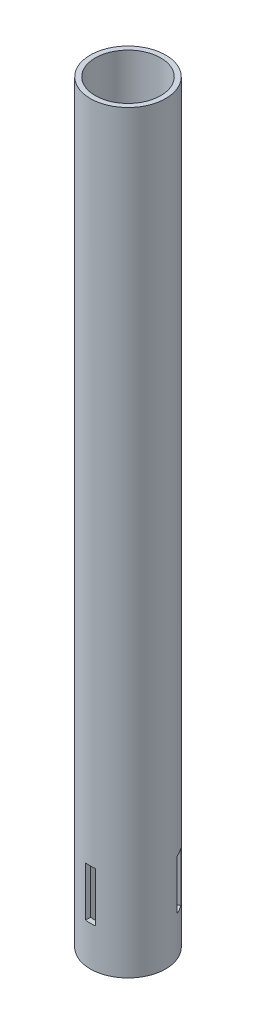
ISO-10303-21;
HEADER;
FILE_DESCRIPTION(('STEP AP214'),'2;1');
FILE_NAME('part.step','',(''),(''),'','','');
FILE_SCHEMA(('AUTOMOTIVE_DESIGN { 1 0 10303 214 1 1 1 1 }'));
ENDSEC;
DATA;
#1=APPLICATION_CONTEXT('core data for automotive mechanical design processes');
#2=APPLICATION_PROTOCOL_DEFINITION('international standard','automotive_design',2000,#1);
#3=PRODUCT_CONTEXT('',#1,'mechanical');
#4=PRODUCT('Part','Part','',(#3));
#5=PRODUCT_RELATED_PRODUCT_CATEGORY('part','',(#4));
#6=PRODUCT_DEFINITION_FORMATION('','',#4);
#7=PRODUCT_DEFINITION_CONTEXT('part definition',#1,'design');
#8=PRODUCT_DEFINITION('design','',#6,#7);
#9=PRODUCT_DEFINITION_SHAPE('','',#8);
#10=(LENGTH_UNIT() NAMED_UNIT(*) SI_UNIT(.MILLI.,.METRE.));
#11=(NAMED_UNIT(*) PLANE_ANGLE_UNIT() SI_UNIT($,.RADIAN.));
#12=(NAMED_UNIT(*) SI_UNIT($,.STERADIAN.) SOLID_ANGLE_UNIT());
#13=UNCERTAINTY_MEASURE_WITH_UNIT(LENGTH_MEASURE(1.E-05),#10,'distance_accuracy_value','');
#14=(GEOMETRIC_REPRESENTATION_CONTEXT(3) GLOBAL_UNCERTAINTY_ASSIGNED_CONTEXT((#13)) GLOBAL_UNIT_ASSIGNED_CONTEXT((#10,
#11,#12)) REPRESENTATION_CONTEXT('',''));
#15=CARTESIAN_POINT('',(0.,0.,0.));
#16=DIRECTION('',(0.,0.,1.));
#17=DIRECTION('',(1.,0.,0.));
#18=AXIS2_PLACEMENT_3D('',#15,#16,#17);
#19=CARTESIAN_POINT('',(0.,760.,0.));
#20=DIRECTION('',(0.,-1.,0.));
#21=DIRECTION('',(0.,0.,-1.));
#22=AXIS2_PLACEMENT_3D('',#19,#20,#21);
#23=CYLINDRICAL_SURFACE('',#22,38.);
#24=CARTESIAN_POINT('',(0.,40.,0.));
#25=DIRECTION('',(0.,1.,0.));
#26=DIRECTION('',(0.,0.,1.));
#27=AXIS2_PLACEMENT_3D('',#24,#25,#26);
#28=CIRCLE('',#27,38.);
#29=CARTESIAN_POINT('',(-5.,40.,37.6696164036747));
#30=VERTEX_POINT('',#29);
#31=CARTESIAN_POINT('',(5.,40.,37.6696164036747));
#32=VERTEX_POINT('',#31);
#33=EDGE_CURVE('E203',#30,#32,#28,.T.);
#34=ORIENTED_EDGE('',*,*,#33,.F.);
#35=DIRECTION('',(0.,-1.,0.));
#36=VECTOR('',#35,1.);
#37=CARTESIAN_POINT('',(-5.00000000000003,760.,37.6696164036747));
#38=LINE('',#37,#36);
#39=CARTESIAN_POINT('',(-5.00000000000003,89.9999999999999,37.6696164036747));
#40=VERTEX_POINT('',#39);
#41=EDGE_CURVE('E192',#30,#40,#38,.F.);
#42=ORIENTED_EDGE('',*,*,#41,.T.);
#43=CARTESIAN_POINT('',(0.,89.9999999999999,0.));
#44=DIRECTION('',(0.,1.,0.));
#45=DIRECTION('',(0.,0.,1.));
#46=AXIS2_PLACEMENT_3D('',#43,#44,#45);
#47=CIRCLE('',#46,38.);
#48=CARTESIAN_POINT('',(5.,89.9999999999999,37.6696164036747));
#49=VERTEX_POINT('',#48);
#50=EDGE_CURVE('E196',#40,#49,#47,.T.);
#51=ORIENTED_EDGE('',*,*,#50,.T.);
#52=DIRECTION('',(0.,-1.,0.));
#53=VECTOR('',#52,1.);
#54=CARTESIAN_POINT('',(4.99999999999997,760.,37.6696164036747));
#55=LINE('',#54,#53);
#56=EDGE_CURVE('E200',#32,#49,#55,.F.);
#57=ORIENTED_EDGE('',*,*,#56,.F.);
#58=EDGE_LOOP('',(#34,#42,#51,#57));
#59=FACE_BOUND('',#58,.T.);
#60=CARTESIAN_POINT('',(0.,760.,0.));
#61=DIRECTION('',(0.,1.,0.));
#62=DIRECTION('',(0.,0.,1.));
#63=AXIS2_PLACEMENT_3D('',#60,#61,#62);
#64=CIRCLE('',#63,38.);
#65=CARTESIAN_POINT('',(0.,760.,38.));
#66=VERTEX_POINT('',#65);
#67=EDGE_CURVE('E215',#66,#66,#64,.T.);
#68=ORIENTED_EDGE('',*,*,#67,.F.);
#69=EDGE_LOOP('',(#68));
#70=FACE_BOUND('',#69,.T.);
#71=CARTESIAN_POINT('',(0.,0.,0.));
#72=DIRECTION('',(0.,1.,0.));
#73=DIRECTION('',(0.,0.,1.));
#74=AXIS2_PLACEMENT_3D('',#71,#72,#73);
#75=CIRCLE('',#74,38.);
#76=CARTESIAN_POINT('',(0.,0.,38.));
#77=VERTEX_POINT('',#76);
#78=EDGE_CURVE('E211',#77,#77,#75,.T.);
#79=ORIENTED_EDGE('',*,*,#78,.T.);
#80=EDGE_LOOP('',(#79));
#81=FACE_BOUND('',#80,.T.);
#82=CARTESIAN_POINT('',(0.,40.,0.));
#83=DIRECTION('',(0.,1.,0.));
#84=DIRECTION('',(0.,0.,1.));
#85=AXIS2_PLACEMENT_3D('',#82,#83,#84);
#86=CIRCLE('',#85,38.);
#87=CARTESIAN_POINT('',(-30.1228447563975,40.,-23.1649352207593));
#88=VERTEX_POINT('',#87);
#89=CARTESIAN_POINT('',(-35.1228447563974,40.,-14.5046811829149));
#90=VERTEX_POINT('',#89);
#91=EDGE_CURVE('E173',#88,#90,#86,.T.);
#92=ORIENTED_EDGE('',*,*,#91,.F.);
#93=DIRECTION('',(0.,-1.,0.));
#94=VECTOR('',#93,1.);
#95=CARTESIAN_POINT('',(-30.1228447563975,760.,-23.1649352207593));
#96=LINE('',#95,#94);
#97=CARTESIAN_POINT('',(-30.1228447563975,90.,-23.1649352207593));
#98=VERTEX_POINT('',#97);
#99=EDGE_CURVE('E143',#88,#98,#96,.F.);
#100=ORIENTED_EDGE('',*,*,#99,.T.);
#101=CARTESIAN_POINT('',(0.,89.9999999999999,0.));
#102=DIRECTION('',(0.,1.,0.));
#103=DIRECTION('',(0.,0.,1.));
#104=AXIS2_PLACEMENT_3D('',#101,#102,#103);
#105=CIRCLE('',#104,38.);
#106=CARTESIAN_POINT('',(-35.1228447563974,90.,-14.5046811829148));
#107=VERTEX_POINT('',#106);
#108=EDGE_CURVE('E149',#98,#107,#105,.T.);
#109=ORIENTED_EDGE('',*,*,#108,.T.);
#110=DIRECTION('',(0.,-1.,0.));
#111=VECTOR('',#110,1.);
#112=CARTESIAN_POINT('',(-35.1228447563974,760.,-14.5046811829149));
#113=LINE('',#112,#111);
#114=EDGE_CURVE('E134',#90,#107,#113,.F.);
#115=ORIENTED_EDGE('',*,*,#114,.F.);
#116=EDGE_LOOP('',(#92,#100,#109,#115));
#117=FACE_BOUND('',#116,.T.);
#118=CARTESIAN_POINT('',(35.1228447563972,40.,-14.5046811829153));
#119=VERTEX_POINT('',#118);
#120=CARTESIAN_POINT('',(30.1228447563972,40.,-23.1649352207597));
#121=VERTEX_POINT('',#120);
#122=EDGE_CURVE('E176',#119,#121,#86,.T.);
#123=ORIENTED_EDGE('',*,*,#122,.F.);
#124=DIRECTION('',(0.,-1.,0.));
#125=VECTOR('',#124,1.);
#126=CARTESIAN_POINT('',(35.1228447563973,760.,-14.5046811829153));
#127=LINE('',#126,#125);
#128=CARTESIAN_POINT('',(35.1228447563973,89.9999999999999,-14.5046811829153));
#129=VERTEX_POINT('',#128);
#130=EDGE_CURVE('E161',#119,#129,#127,.F.);
#131=ORIENTED_EDGE('',*,*,#130,.T.);
#132=CARTESIAN_POINT('',(30.1228447563972,89.9999999999999,-23.1649352207597));
#133=VERTEX_POINT('',#132);
#134=EDGE_CURVE('E160',#129,#133,#105,.T.);
#135=ORIENTED_EDGE('',*,*,#134,.T.);
#136=DIRECTION('',(0.,-1.,0.));
#137=VECTOR('',#136,1.);
#138=CARTESIAN_POINT('',(30.1228447563972,760.,-23.1649352207597));
#139=LINE('',#138,#137);
#140=EDGE_CURVE('E166',#121,#133,#139,.F.);
#141=ORIENTED_EDGE('',*,*,#140,.F.);
#142=EDGE_LOOP('',(#123,#131,#135,#141));
#143=FACE_BOUND('',#142,.T.);
#144=ADVANCED_FACE('F45',(#59,#70,#81,#117,#143),#23,.T.);
#145=CARTESIAN_POINT('',(0.,760.,0.));
#146=DIRECTION('',(0.,-1.,0.));
#147=DIRECTION('',(0.,0.,-1.));
#148=AXIS2_PLACEMENT_3D('',#145,#146,#147);
#149=CYLINDRICAL_SURFACE('',#148,33.);
#150=DIRECTION('',(0.,-1.,0.));
#151=VECTOR('',#150,1.);
#152=CARTESIAN_POINT('',(-25.7488937836512,760.,-20.6396334492221));
#153=LINE('',#152,#151);
#154=CARTESIAN_POINT('',(-25.7488937836513,40.,-20.639633449222));
#155=VERTEX_POINT('',#154);
#156=CARTESIAN_POINT('',(-25.7488937836513,90.,-20.639633449222));
#157=VERTEX_POINT('',#156);
#158=EDGE_CURVE('E244',#155,#157,#153,.F.);
#159=ORIENTED_EDGE('',*,*,#158,.F.);
#160=CARTESIAN_POINT('',(0.,40.,0.));
#161=DIRECTION('',(0.,1.,0.));
#162=DIRECTION('',(0.,0.,1.));
#163=AXIS2_PLACEMENT_3D('',#160,#161,#162);
#164=CIRCLE('',#163,33.);
#165=CARTESIAN_POINT('',(-30.7488937836512,40.,-11.9793794113776));
#166=VERTEX_POINT('',#165);
#167=EDGE_CURVE('E55',#155,#166,#164,.T.);
#168=ORIENTED_EDGE('',*,*,#167,.T.);
#169=DIRECTION('',(0.,-1.,0.));
#170=VECTOR('',#169,1.);
#171=CARTESIAN_POINT('',(-30.7488937836512,760.,-11.9793794113776));
#172=LINE('',#171,#170);
#173=CARTESIAN_POINT('',(-30.7488937836512,89.9999999999999,-11.9793794113776));
#174=VERTEX_POINT('',#173);
#175=EDGE_CURVE('E236',#166,#174,#172,.F.);
#176=ORIENTED_EDGE('',*,*,#175,.T.);
#177=CARTESIAN_POINT('',(0.,89.9999999999999,0.));
#178=DIRECTION('',(0.,1.,0.));
#179=DIRECTION('',(0.,0.,1.));
#180=AXIS2_PLACEMENT_3D('',#177,#178,#179);
#181=CIRCLE('',#180,33.);
#182=EDGE_CURVE('E152',#157,#174,#181,.T.);
#183=ORIENTED_EDGE('',*,*,#182,.F.);
#184=EDGE_LOOP('',(#159,#168,#176,#183));
#185=FACE_BOUND('',#184,.T.);
#186=CARTESIAN_POINT('',(0.,760.,0.));
#187=DIRECTION('',(0.,1.,0.));
#188=DIRECTION('',(0.,0.,1.));
#189=AXIS2_PLACEMENT_3D('',#186,#187,#188);
#190=CIRCLE('',#189,33.);
#191=CARTESIAN_POINT('',(0.,760.,33.));
#192=VERTEX_POINT('',#191);
#193=EDGE_CURVE('E207',#192,#192,#190,.T.);
#194=ORIENTED_EDGE('',*,*,#193,.T.);
#195=EDGE_LOOP('',(#194));
#196=FACE_BOUND('',#195,.T.);
#197=CARTESIAN_POINT('',(0.,0.,0.));
#198=DIRECTION('',(0.,1.,0.));
#199=DIRECTION('',(0.,0.,1.));
#200=AXIS2_PLACEMENT_3D('',#197,#198,#199);
#201=CIRCLE('',#200,33.);
#202=CARTESIAN_POINT('',(0.,0.,33.));
#203=VERTEX_POINT('',#202);
#204=EDGE_CURVE('E206',#203,#203,#201,.T.);
#205=ORIENTED_EDGE('',*,*,#204,.F.);
#206=EDGE_LOOP('',(#205));
#207=FACE_BOUND('',#206,.T.);
#208=DIRECTION('',(0.,-1.,0.));
#209=VECTOR('',#208,1.);
#210=CARTESIAN_POINT('',(-5.00000000000003,760.,32.6190128606002));
#211=LINE('',#210,#209);
#212=CARTESIAN_POINT('',(-5.00000000000003,40.,32.6190128606002));
#213=VERTEX_POINT('',#212);
#214=CARTESIAN_POINT('',(-5.,90.,32.6190128606002));
#215=VERTEX_POINT('',#214);
#216=EDGE_CURVE('E219',#213,#215,#211,.F.);
#217=ORIENTED_EDGE('',*,*,#216,.F.);
#218=CARTESIAN_POINT('',(0.,40.,0.));
#219=DIRECTION('',(0.,1.,0.));
#220=DIRECTION('',(0.,0.,1.));
#221=AXIS2_PLACEMENT_3D('',#218,#219,#220);
#222=CIRCLE('',#221,33.);
#223=CARTESIAN_POINT('',(5.,40.,32.6190128606002));
#224=VERTEX_POINT('',#223);
#225=EDGE_CURVE('E232',#213,#224,#222,.T.);
#226=ORIENTED_EDGE('',*,*,#225,.T.);
#227=DIRECTION('',(0.,-1.,0.));
#228=VECTOR('',#227,1.);
#229=CARTESIAN_POINT('',(4.99999999999997,760.,32.6190128606002));
#230=LINE('',#229,#228);
#231=CARTESIAN_POINT('',(5.,89.9999999999999,32.6190128606002));
#232=VERTEX_POINT('',#231);
#233=EDGE_CURVE('E228',#224,#232,#230,.F.);
#234=ORIENTED_EDGE('',*,*,#233,.T.);
#235=CARTESIAN_POINT('',(0.,89.9999999999999,0.));
#236=DIRECTION('',(0.,1.,0.));
#237=DIRECTION('',(0.,0.,1.));
#238=AXIS2_PLACEMENT_3D('',#235,#236,#237);
#239=CIRCLE('',#238,33.);
#240=EDGE_CURVE('E225',#215,#232,#239,.T.);
#241=ORIENTED_EDGE('',*,*,#240,.F.);
#242=EDGE_LOOP('',(#217,#226,#234,#241));
#243=FACE_BOUND('',#242,.T.);
#244=DIRECTION('',(0.,-1.,0.));
#245=VECTOR('',#244,1.);
#246=CARTESIAN_POINT('',(30.748893783651,760.,-11.979379411378));
#247=LINE('',#246,#245);
#248=CARTESIAN_POINT('',(30.748893783651,40.,-11.979379411378));
#249=VERTEX_POINT('',#248);
#250=CARTESIAN_POINT('',(30.748893783651,90.,-11.979379411378));
#251=VERTEX_POINT('',#250);
#252=EDGE_CURVE('E246',#249,#251,#247,.F.);
#253=ORIENTED_EDGE('',*,*,#252,.F.);
#254=CARTESIAN_POINT('',(25.748893783651,40.,-20.6396334492224));
#255=VERTEX_POINT('',#254);
#256=EDGE_CURVE('E11',#249,#255,#164,.T.);
#257=ORIENTED_EDGE('',*,*,#256,.T.);
#258=DIRECTION('',(0.,-1.,0.));
#259=VECTOR('',#258,1.);
#260=CARTESIAN_POINT('',(25.748893783651,760.,-20.6396334492224));
#261=LINE('',#260,#259);
#262=CARTESIAN_POINT('',(25.748893783651,89.9999999999999,-20.6396334492224));
#263=VERTEX_POINT('',#262);
#264=EDGE_CURVE('E48',#255,#263,#261,.F.);
#265=ORIENTED_EDGE('',*,*,#264,.T.);
#266=EDGE_CURVE('E240',#251,#263,#181,.T.);
#267=ORIENTED_EDGE('',*,*,#266,.F.);
#268=EDGE_LOOP('',(#253,#257,#265,#267));
#269=FACE_BOUND('',#268,.T.);
#270=ADVANCED_FACE('F257',(#185,#196,#207,#243,#269),#149,.F.);
#271=CARTESIAN_POINT('',(0.,760.,0.));
#272=DIRECTION('',(0.,1.,0.));
#273=DIRECTION('',(0.,0.,1.));
#274=AXIS2_PLACEMENT_3D('',#271,#272,#273);
#275=PLANE('',#274);
#276=ORIENTED_EDGE('',*,*,#67,.T.);
#277=EDGE_LOOP('',(#276));
#278=FACE_BOUND('',#277,.T.);
#279=ORIENTED_EDGE('',*,*,#193,.F.);
#280=EDGE_LOOP('',(#279));
#281=FACE_BOUND('',#280,.T.);
#282=ADVANCED_FACE('F310',(#278,#281),#275,.T.);
#283=CARTESIAN_POINT('',(0.,0.,0.));
#284=DIRECTION('',(0.,1.,0.));
#285=DIRECTION('',(0.,0.,1.));
#286=AXIS2_PLACEMENT_3D('',#283,#284,#285);
#287=PLANE('',#286);
#288=ORIENTED_EDGE('',*,*,#78,.F.);
#289=EDGE_LOOP('',(#288));
#290=FACE_BOUND('',#289,.T.);
#291=ORIENTED_EDGE('',*,*,#204,.T.);
#292=EDGE_LOOP('',(#291));
#293=FACE_BOUND('',#292,.T.);
#294=ADVANCED_FACE('F319',(#290,#293),#287,.F.);
#295=CARTESIAN_POINT('',(-5.,40.,79.9999999999999));
#296=DIRECTION('',(0.,1.,0.));
#297=DIRECTION('',(0.,0.,1.));
#298=AXIS2_PLACEMENT_3D('',#295,#296,#297);
#299=PLANE('',#298);
#300=ORIENTED_EDGE('',*,*,#33,.T.);
#301=DIRECTION('',(0.,0.,-1.));
#302=VECTOR('',#301,1.);
#303=CARTESIAN_POINT('',(5.,40.,79.9999999999999));
#304=LINE('',#303,#302);
#305=EDGE_CURVE('E188',#32,#224,#304,.T.);
#306=ORIENTED_EDGE('',*,*,#305,.T.);
#307=ORIENTED_EDGE('',*,*,#225,.F.);
#308=DIRECTION('',(0.,0.,-1.));
#309=VECTOR('',#308,1.);
#310=CARTESIAN_POINT('',(-5.,40.,79.9999999999999));
#311=LINE('',#310,#309);
#312=EDGE_CURVE('E177',#30,#213,#311,.T.);
#313=ORIENTED_EDGE('',*,*,#312,.F.);
#314=EDGE_LOOP('',(#300,#306,#307,#313));
#315=FACE_BOUND('',#314,.T.);
#316=ADVANCED_FACE('F322',(#315),#299,.T.);
#317=CARTESIAN_POINT('',(5.,40.,79.9999999999999));
#318=DIRECTION('',(-1.,0.,0.));
#319=DIRECTION('',(0.,-1.,0.));
#320=AXIS2_PLACEMENT_3D('',#317,#318,#319);
#321=PLANE('',#320);
#322=ORIENTED_EDGE('',*,*,#56,.T.);
#323=DIRECTION('',(0.,0.,-1.));
#324=VECTOR('',#323,1.);
#325=CARTESIAN_POINT('',(5.,90.,79.9999999999999));
#326=LINE('',#325,#324);
#327=EDGE_CURVE('E184',#49,#232,#326,.T.);
#328=ORIENTED_EDGE('',*,*,#327,.T.);
#329=ORIENTED_EDGE('',*,*,#233,.F.);
#330=ORIENTED_EDGE('',*,*,#305,.F.);
#331=EDGE_LOOP('',(#322,#328,#329,#330));
#332=FACE_BOUND('',#331,.T.);
#333=ADVANCED_FACE('F339',(#332),#321,.T.);
#334=CARTESIAN_POINT('',(-5.,90.,79.9999999999999));
#335=DIRECTION('',(0.,1.,0.));
#336=DIRECTION('',(0.,0.,1.));
#337=AXIS2_PLACEMENT_3D('',#334,#335,#336);
#338=PLANE('',#337);
#339=DIRECTION('',(0.,0.,-1.));
#340=VECTOR('',#339,1.);
#341=CARTESIAN_POINT('',(-5.,90.,79.9999999999999));
#342=LINE('',#341,#340);
#343=EDGE_CURVE('E180',#40,#215,#342,.T.);
#344=ORIENTED_EDGE('',*,*,#343,.T.);
#345=ORIENTED_EDGE('',*,*,#240,.T.);
#346=ORIENTED_EDGE('',*,*,#327,.F.);
#347=ORIENTED_EDGE('',*,*,#50,.F.);
#348=EDGE_LOOP('',(#344,#345,#346,#347));
#349=FACE_BOUND('',#348,.T.);
#350=ADVANCED_FACE('F334',(#349),#338,.F.);
#351=CARTESIAN_POINT('',(-5.,40.,79.9999999999999));
#352=DIRECTION('',(-1.,0.,0.));
#353=DIRECTION('',(0.,-1.,0.));
#354=AXIS2_PLACEMENT_3D('',#351,#352,#353);
#355=PLANE('',#354);
#356=ORIENTED_EDGE('',*,*,#312,.T.);
#357=ORIENTED_EDGE('',*,*,#216,.T.);
#358=ORIENTED_EDGE('',*,*,#343,.F.);
#359=ORIENTED_EDGE('',*,*,#41,.F.);
#360=EDGE_LOOP('',(#356,#357,#358,#359));
#361=FACE_BOUND('',#360,.T.);
#362=ADVANCED_FACE('F330',(#361),#355,.F.);
#363=CARTESIAN_POINT('',(-71.7820323027553,40.,-35.6698729810771));
#364=DIRECTION('',(0.499999999999992,0.,-0.866025403784443));
#365=DIRECTION('',(-0.866025403784443,0.,-0.499999999999992));
#366=AXIS2_PLACEMENT_3D('',#363,#364,#365);
#367=PLANE('',#366);
#368=ORIENTED_EDGE('',*,*,#114,.T.);
#369=DIRECTION('',(0.866025403784443,0.,0.499999999999992));
#370=VECTOR('',#369,1.);
#371=CARTESIAN_POINT('',(-71.7820323027553,90.,-35.6698729810771));
#372=LINE('',#371,#370);
#373=EDGE_CURVE('E137',#107,#174,#372,.T.);
#374=ORIENTED_EDGE('',*,*,#373,.T.);
#375=ORIENTED_EDGE('',*,*,#175,.F.);
#376=DIRECTION('',(0.866025403784443,0.,0.499999999999992));
#377=VECTOR('',#376,1.);
#378=CARTESIAN_POINT('',(-71.7820323027553,40.,-35.6698729810771));
#379=LINE('',#378,#377);
#380=EDGE_CURVE('E70',#90,#166,#379,.T.);
#381=ORIENTED_EDGE('',*,*,#380,.F.);
#382=EDGE_LOOP('',(#368,#374,#375,#381));
#383=FACE_BOUND('',#382,.T.);
#384=ADVANCED_FACE('F136',(#383),#367,.T.);
#385=CARTESIAN_POINT('',(-66.7820323027554,40.,-44.3301270189215));
#386=DIRECTION('',(0.499999999999992,0.,-0.866025403784443));
#387=DIRECTION('',(-0.866025403784443,0.,-0.499999999999992));
#388=AXIS2_PLACEMENT_3D('',#385,#386,#387);
#389=PLANE('',#388);
#390=DIRECTION('',(0.866025403784443,0.,0.499999999999992));
#391=VECTOR('',#390,1.);
#392=CARTESIAN_POINT('',(-66.7820323027554,40.,-44.3301270189215));
#393=LINE('',#392,#391);
#394=EDGE_CURVE('E284',#88,#155,#393,.T.);
#395=ORIENTED_EDGE('',*,*,#394,.T.);
#396=ORIENTED_EDGE('',*,*,#158,.T.);
#397=DIRECTION('',(0.866025403784443,0.,0.499999999999992));
#398=VECTOR('',#397,1.);
#399=CARTESIAN_POINT('',(-66.7820323027554,90.,-44.3301270189215));
#400=LINE('',#399,#398);
#401=EDGE_CURVE('E155',#98,#157,#400,.T.);
#402=ORIENTED_EDGE('',*,*,#401,.F.);
#403=ORIENTED_EDGE('',*,*,#99,.F.);
#404=EDGE_LOOP('',(#395,#396,#402,#403));
#405=FACE_BOUND('',#404,.T.);
#406=ADVANCED_FACE('F290',(#405),#389,.F.);
#407=CARTESIAN_POINT('',(71.7820323027548,90.,-35.6698729810781));
#408=DIRECTION('',(0.,1.,0.));
#409=DIRECTION('',(0.,0.,1.));
#410=AXIS2_PLACEMENT_3D('',#407,#408,#409);
#411=PLANE('',#410);
#412=ORIENTED_EDGE('',*,*,#401,.T.);
#413=ORIENTED_EDGE('',*,*,#182,.T.);
#414=ORIENTED_EDGE('',*,*,#373,.F.);
#415=ORIENTED_EDGE('',*,*,#108,.F.);
#416=EDGE_LOOP('',(#412,#413,#414,#415));
#417=FACE_BOUND('',#416,.T.);
#418=ADVANCED_FACE('F148',(#417),#411,.F.);
#419=CARTESIAN_POINT('',(71.7820323027548,40.,-35.6698729810781));
#420=DIRECTION('',(0.,1.,0.));
#421=DIRECTION('',(0.,0.,1.));
#422=AXIS2_PLACEMENT_3D('',#419,#420,#421);
#423=PLANE('',#422);
#424=ORIENTED_EDGE('',*,*,#91,.T.);
#425=ORIENTED_EDGE('',*,*,#380,.T.);
#426=ORIENTED_EDGE('',*,*,#167,.F.);
#427=ORIENTED_EDGE('',*,*,#394,.F.);
#428=EDGE_LOOP('',(#424,#425,#426,#427));
#429=FACE_BOUND('',#428,.T.);
#430=ADVANCED_FACE('F294',(#429),#423,.T.);
#431=ORIENTED_EDGE('',*,*,#122,.T.);
#432=DIRECTION('',(-0.866025403784436,0.,0.500000000000004));
#433=VECTOR('',#432,1.);
#434=CARTESIAN_POINT('',(66.7820323027548,40.,-44.3301270189224));
#435=LINE('',#434,#433);
#436=EDGE_CURVE('E144',#121,#255,#435,.T.);
#437=ORIENTED_EDGE('',*,*,#436,.T.);
#438=ORIENTED_EDGE('',*,*,#256,.F.);
#439=DIRECTION('',(-0.866025403784436,0.,0.500000000000004));
#440=VECTOR('',#439,1.);
#441=CARTESIAN_POINT('',(71.7820323027548,40.,-35.6698729810781));
#442=LINE('',#441,#440);
#443=EDGE_CURVE('E277',#119,#249,#442,.T.);
#444=ORIENTED_EDGE('',*,*,#443,.F.);
#445=EDGE_LOOP('',(#431,#437,#438,#444));
#446=FACE_BOUND('',#445,.T.);
#447=ADVANCED_FACE('F266',(#446),#423,.T.);
#448=CARTESIAN_POINT('',(66.7820323027548,40.,-44.3301270189224));
#449=DIRECTION('',(0.500000000000004,0.,0.866025403784436));
#450=DIRECTION('',(0.866025403784436,0.,-0.500000000000004));
#451=AXIS2_PLACEMENT_3D('',#448,#449,#450);
#452=PLANE('',#451);
#453=ORIENTED_EDGE('',*,*,#140,.T.);
#454=DIRECTION('',(-0.866025403784436,0.,0.500000000000004));
#455=VECTOR('',#454,1.);
#456=CARTESIAN_POINT('',(66.7820323027548,90.,-44.3301270189224));
#457=LINE('',#456,#455);
#458=EDGE_CURVE('E264',#133,#263,#457,.T.);
#459=ORIENTED_EDGE('',*,*,#458,.T.);
#460=ORIENTED_EDGE('',*,*,#264,.F.);
#461=ORIENTED_EDGE('',*,*,#436,.F.);
#462=EDGE_LOOP('',(#453,#459,#460,#461));
#463=FACE_BOUND('',#462,.T.);
#464=ADVANCED_FACE('F262',(#463),#452,.T.);
#465=DIRECTION('',(-0.866025403784436,0.,0.500000000000004));
#466=VECTOR('',#465,1.);
#467=CARTESIAN_POINT('',(71.7820323027548,90.,-35.6698729810781));
#468=LINE('',#467,#466);
#469=EDGE_CURVE('E62',#129,#251,#468,.T.);
#470=ORIENTED_EDGE('',*,*,#469,.T.);
#471=ORIENTED_EDGE('',*,*,#266,.T.);
#472=ORIENTED_EDGE('',*,*,#458,.F.);
#473=ORIENTED_EDGE('',*,*,#134,.F.);
#474=EDGE_LOOP('',(#470,#471,#472,#473));
#475=FACE_BOUND('',#474,.T.);
#476=ADVANCED_FACE('F302',(#475),#411,.F.);
#477=CARTESIAN_POINT('',(71.7820323027548,40.,-35.6698729810781));
#478=DIRECTION('',(0.500000000000004,0.,0.866025403784436));
#479=DIRECTION('',(0.866025403784436,0.,-0.500000000000004));
#480=AXIS2_PLACEMENT_3D('',#477,#478,#479);
#481=PLANE('',#480);
#482=ORIENTED_EDGE('',*,*,#443,.T.);
#483=ORIENTED_EDGE('',*,*,#252,.T.);
#484=ORIENTED_EDGE('',*,*,#469,.F.);
#485=ORIENTED_EDGE('',*,*,#130,.F.);
#486=EDGE_LOOP('',(#482,#483,#484,#485));
#487=FACE_BOUND('',#486,.T.);
#488=ADVANCED_FACE('F450',(#487),#481,.F.);
#489=CLOSED_SHELL('',(#144,#270,#282,#294,#316,#333,#350,#362,#384,#406,#418,#430,#447,#464,
#476,#488));
#490=MANIFOLD_SOLID_BREP('B2',#489);
#491=ADVANCED_BREP_SHAPE_REPRESENTATION('',(#18,#490),#14);
#492=SHAPE_DEFINITION_REPRESENTATION(#9,#491);
ENDSEC;
END-ISO-10303-21;
